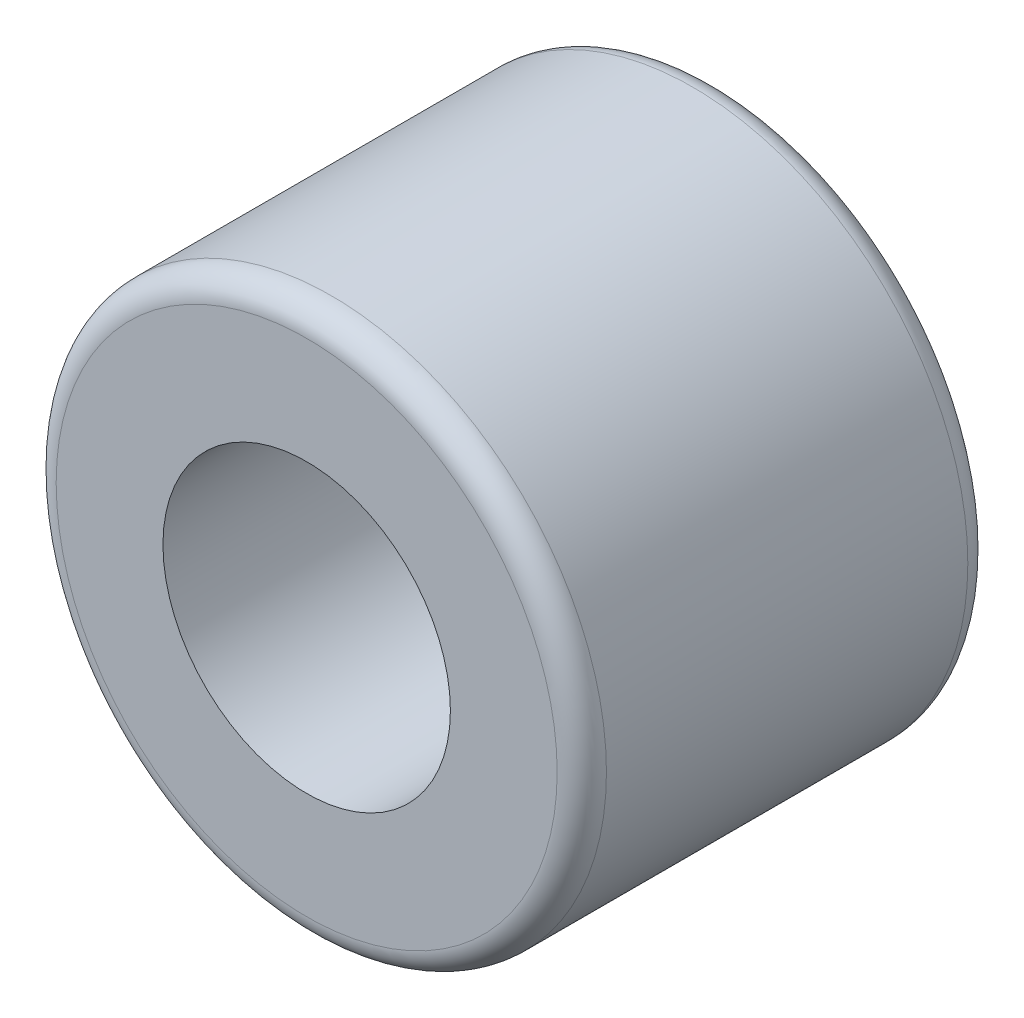
ISO-10303-21;
HEADER;
FILE_DESCRIPTION(('STEP AP214'),'2;1');
FILE_NAME('part.step','',(''),(''),'','','');
FILE_SCHEMA(('AUTOMOTIVE_DESIGN { 1 0 10303 214 1 1 1 1 }'));
ENDSEC;
DATA;
#1=APPLICATION_CONTEXT('core data for automotive mechanical design processes');
#2=APPLICATION_PROTOCOL_DEFINITION('international standard','automotive_design',2000,#1);
#3=PRODUCT_CONTEXT('',#1,'mechanical');
#4=PRODUCT('Part','Part','',(#3));
#5=PRODUCT_RELATED_PRODUCT_CATEGORY('part','',(#4));
#6=PRODUCT_DEFINITION_FORMATION('','',#4);
#7=PRODUCT_DEFINITION_CONTEXT('part definition',#1,'design');
#8=PRODUCT_DEFINITION('design','',#6,#7);
#9=PRODUCT_DEFINITION_SHAPE('','',#8);
#10=(LENGTH_UNIT() NAMED_UNIT(*) SI_UNIT(.MILLI.,.METRE.));
#11=(NAMED_UNIT(*) PLANE_ANGLE_UNIT() SI_UNIT($,.RADIAN.));
#12=(NAMED_UNIT(*) SI_UNIT($,.STERADIAN.) SOLID_ANGLE_UNIT());
#13=UNCERTAINTY_MEASURE_WITH_UNIT(LENGTH_MEASURE(1.E-05),#10,'distance_accuracy_value','');
#14=(GEOMETRIC_REPRESENTATION_CONTEXT(3) GLOBAL_UNCERTAINTY_ASSIGNED_CONTEXT((#13)) GLOBAL_UNIT_ASSIGNED_CONTEXT((#10,
#11,#12)) REPRESENTATION_CONTEXT('',''));
#15=CARTESIAN_POINT('',(0.,0.,0.));
#16=DIRECTION('',(0.,0.,1.));
#17=DIRECTION('',(1.,0.,0.));
#18=AXIS2_PLACEMENT_3D('',#15,#16,#17);
#19=CARTESIAN_POINT('',(0.,0.,12.7));
#20=DIRECTION('',(0.,0.,1.));
#21=DIRECTION('',(1.,0.,0.));
#22=AXIS2_PLACEMENT_3D('',#19,#20,#21);
#23=PLANE('',#22);
#24=CARTESIAN_POINT('',(0.,0.,12.7));
#25=DIRECTION('',(0.,0.,1.));
#26=DIRECTION('',(1.,0.,0.));
#27=AXIS2_PLACEMENT_3D('',#24,#25,#26);
#28=CIRCLE('',#27,7.747);
#29=CARTESIAN_POINT('',(7.747,0.,12.7));
#30=VERTEX_POINT('',#29);
#31=EDGE_CURVE('E49',#30,#30,#28,.T.);
#32=ORIENTED_EDGE('',*,*,#31,.T.);
#33=EDGE_LOOP('',(#32));
#34=FACE_BOUND('',#33,.T.);
#35=CARTESIAN_POINT('',(0.,0.,12.7));
#36=DIRECTION('',(0.,0.,1.));
#37=DIRECTION('',(1.,0.,0.));
#38=AXIS2_PLACEMENT_3D('',#35,#36,#37);
#39=CIRCLE('',#38,4.445);
#40=CARTESIAN_POINT('',(4.445,0.,12.7));
#41=VERTEX_POINT('',#40);
#42=EDGE_CURVE('E54',#41,#41,#39,.T.);
#43=ORIENTED_EDGE('',*,*,#42,.F.);
#44=EDGE_LOOP('',(#43));
#45=FACE_BOUND('',#44,.T.);
#46=ADVANCED_FACE('F34',(#34,#45),#23,.T.);
#47=CARTESIAN_POINT('',(0.,0.,0.));
#48=DIRECTION('',(0.,0.,1.));
#49=DIRECTION('',(1.,0.,0.));
#50=AXIS2_PLACEMENT_3D('',#47,#48,#49);
#51=PLANE('',#50);
#52=CARTESIAN_POINT('',(0.,0.,0.));
#53=DIRECTION('',(0.,0.,1.));
#54=DIRECTION('',(1.,0.,0.));
#55=AXIS2_PLACEMENT_3D('',#52,#53,#54);
#56=CIRCLE('',#55,7.747);
#57=CARTESIAN_POINT('',(7.747,0.,0.));
#58=VERTEX_POINT('',#57);
#59=EDGE_CURVE('E10',#58,#58,#56,.F.);
#60=ORIENTED_EDGE('',*,*,#59,.T.);
#61=EDGE_LOOP('',(#60));
#62=FACE_BOUND('',#61,.T.);
#63=CARTESIAN_POINT('',(0.,0.,0.));
#64=DIRECTION('',(0.,0.,1.));
#65=DIRECTION('',(1.,0.,0.));
#66=AXIS2_PLACEMENT_3D('',#63,#64,#65);
#67=CIRCLE('',#66,4.445);
#68=CARTESIAN_POINT('',(4.445,0.,0.));
#69=VERTEX_POINT('',#68);
#70=EDGE_CURVE('E55',#69,#69,#67,.T.);
#71=ORIENTED_EDGE('',*,*,#70,.T.);
#72=EDGE_LOOP('',(#71));
#73=FACE_BOUND('',#72,.T.);
#74=ADVANCED_FACE('F65',(#62,#73),#51,.F.);
#75=CARTESIAN_POINT('',(0.,0.,12.7));
#76=DIRECTION('',(0.,0.,-1.));
#77=DIRECTION('',(-1.,0.,0.));
#78=AXIS2_PLACEMENT_3D('',#75,#76,#77);
#79=CYLINDRICAL_SURFACE('',#78,8.509);
#80=CARTESIAN_POINT('',(0.,0.,11.938));
#81=DIRECTION('',(0.,0.,1.));
#82=DIRECTION('',(1.,0.,0.));
#83=AXIS2_PLACEMENT_3D('',#80,#81,#82);
#84=CIRCLE('',#83,8.509);
#85=CARTESIAN_POINT('',(8.509,0.,11.938));
#86=VERTEX_POINT('',#85);
#87=EDGE_CURVE('E41',#86,#86,#84,.F.);
#88=ORIENTED_EDGE('',*,*,#87,.T.);
#89=EDGE_LOOP('',(#88));
#90=FACE_BOUND('',#89,.T.);
#91=CARTESIAN_POINT('',(0.,0.,0.762000000000001));
#92=DIRECTION('',(0.,0.,1.));
#93=DIRECTION('',(1.,0.,0.));
#94=AXIS2_PLACEMENT_3D('',#91,#92,#93);
#95=CIRCLE('',#94,8.509);
#96=CARTESIAN_POINT('',(8.509,0.,0.762000000000001));
#97=VERTEX_POINT('',#96);
#98=EDGE_CURVE('E45',#97,#97,#95,.T.);
#99=ORIENTED_EDGE('',*,*,#98,.T.);
#100=EDGE_LOOP('',(#99));
#101=FACE_BOUND('',#100,.T.);
#102=ADVANCED_FACE('F71',(#90,#101),#79,.T.);
#103=CARTESIAN_POINT('',(0.,0.,12.7));
#104=DIRECTION('',(0.,0.,-1.));
#105=DIRECTION('',(-1.,0.,0.));
#106=AXIS2_PLACEMENT_3D('',#103,#104,#105);
#107=CYLINDRICAL_SURFACE('',#106,4.445);
#108=ORIENTED_EDGE('',*,*,#42,.T.);
#109=EDGE_LOOP('',(#108));
#110=FACE_BOUND('',#109,.T.);
#111=ORIENTED_EDGE('',*,*,#70,.F.);
#112=EDGE_LOOP('',(#111));
#113=FACE_BOUND('',#112,.T.);
#114=ADVANCED_FACE('F61',(#110,#113),#107,.F.);
#115=CARTESIAN_POINT('',(0.,0.,11.938));
#116=DIRECTION('',(0.,0.,1.));
#117=DIRECTION('',(1.,0.,0.));
#118=AXIS2_PLACEMENT_3D('',#115,#116,#117);
#119=TOROIDAL_SURFACE('',#118,7.747,0.762);
#120=ORIENTED_EDGE('',*,*,#87,.F.);
#121=EDGE_LOOP('',(#120));
#122=FACE_BOUND('',#121,.T.);
#123=ORIENTED_EDGE('',*,*,#31,.F.);
#124=EDGE_LOOP('',(#123));
#125=FACE_BOUND('',#124,.T.);
#126=ADVANCED_FACE('F76',(#122,#125),#119,.T.);
#127=CARTESIAN_POINT('',(0.,0.,0.762000000000001));
#128=DIRECTION('',(0.,0.,1.));
#129=DIRECTION('',(1.,0.,0.));
#130=AXIS2_PLACEMENT_3D('',#127,#128,#129);
#131=TOROIDAL_SURFACE('',#130,7.747,0.762);
#132=ORIENTED_EDGE('',*,*,#59,.F.);
#133=EDGE_LOOP('',(#132));
#134=FACE_BOUND('',#133,.T.);
#135=ORIENTED_EDGE('',*,*,#98,.F.);
#136=EDGE_LOOP('',(#135));
#137=FACE_BOUND('',#136,.T.);
#138=ADVANCED_FACE('F36',(#134,#137),#131,.T.);
#139=CLOSED_SHELL('',(#46,#74,#102,#114,#126,#138));
#140=MANIFOLD_SOLID_BREP('B2',#139);
#141=ADVANCED_BREP_SHAPE_REPRESENTATION('',(#18,#140),#14);
#142=SHAPE_DEFINITION_REPRESENTATION(#9,#141);
ENDSEC;
END-ISO-10303-21;
